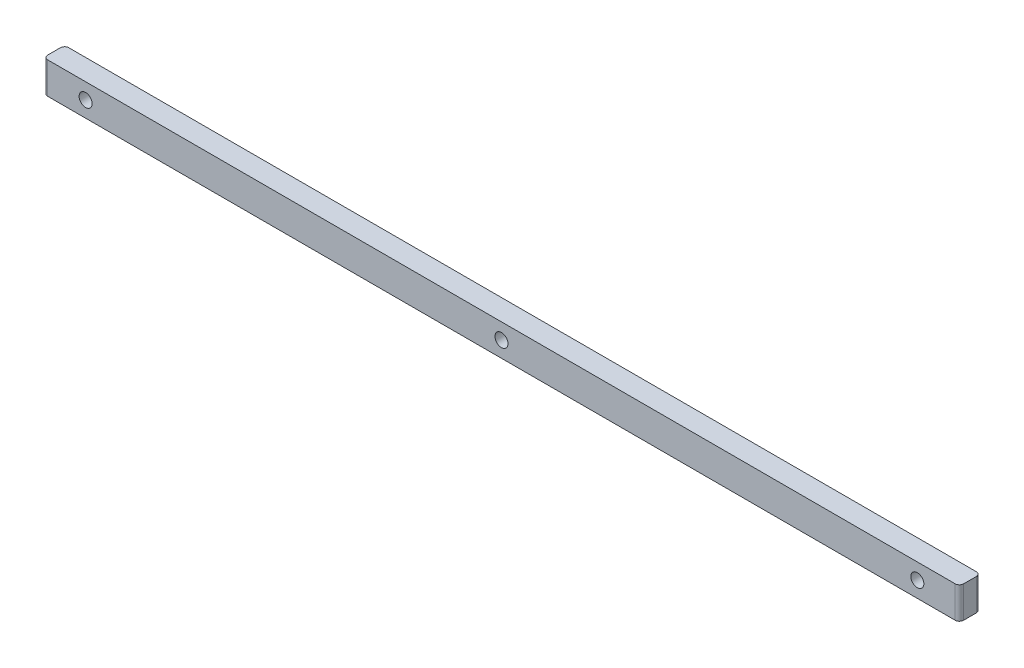
ISO-10303-21;
HEADER;
FILE_DESCRIPTION(('STEP AP214'),'2;1');
FILE_NAME('part.step','',(''),(''),'','','');
FILE_SCHEMA(('AUTOMOTIVE_DESIGN { 1 0 10303 214 1 1 1 1 }'));
ENDSEC;
DATA;
#1=APPLICATION_CONTEXT('core data for automotive mechanical design processes');
#2=APPLICATION_PROTOCOL_DEFINITION('international standard','automotive_design',2000,#1);
#3=PRODUCT_CONTEXT('',#1,'mechanical');
#4=PRODUCT('Part','Part','',(#3));
#5=PRODUCT_RELATED_PRODUCT_CATEGORY('part','',(#4));
#6=PRODUCT_DEFINITION_FORMATION('','',#4);
#7=PRODUCT_DEFINITION_CONTEXT('part definition',#1,'design');
#8=PRODUCT_DEFINITION('design','',#6,#7);
#9=PRODUCT_DEFINITION_SHAPE('','',#8);
#10=(LENGTH_UNIT() NAMED_UNIT(*) SI_UNIT(.MILLI.,.METRE.));
#11=(NAMED_UNIT(*) PLANE_ANGLE_UNIT() SI_UNIT($,.RADIAN.));
#12=(NAMED_UNIT(*) SI_UNIT($,.STERADIAN.) SOLID_ANGLE_UNIT());
#13=UNCERTAINTY_MEASURE_WITH_UNIT(LENGTH_MEASURE(1.E-05),#10,'distance_accuracy_value','');
#14=(GEOMETRIC_REPRESENTATION_CONTEXT(3) GLOBAL_UNCERTAINTY_ASSIGNED_CONTEXT((#13)) GLOBAL_UNIT_ASSIGNED_CONTEXT((#10,
#11,#12)) REPRESENTATION_CONTEXT('',''));
#15=CARTESIAN_POINT('',(0.,0.,0.));
#16=DIRECTION('',(0.,0.,1.));
#17=DIRECTION('',(1.,0.,0.));
#18=AXIS2_PLACEMENT_3D('',#15,#16,#17);
#19=CARTESIAN_POINT('',(276.225,-9.525,6.35));
#20=DIRECTION('',(-1.,0.,0.));
#21=DIRECTION('',(0.,0.,1.));
#22=AXIS2_PLACEMENT_3D('',#19,#20,#21);
#23=PLANE('',#22);
#24=DIRECTION('',(0.,0.,-1.));
#25=VECTOR('',#24,1.);
#26=CARTESIAN_POINT('',(276.225,-9.525,6.35));
#27=LINE('',#26,#25);
#28=CARTESIAN_POINT('',(276.225,-9.525,3.81));
#29=VERTEX_POINT('',#28);
#30=CARTESIAN_POINT('',(276.225,-9.525,-3.81));
#31=VERTEX_POINT('',#30);
#32=EDGE_CURVE('E130',#29,#31,#27,.T.);
#33=ORIENTED_EDGE('',*,*,#32,.T.);
#34=DIRECTION('',(0.,1.,0.));
#35=VECTOR('',#34,1.);
#36=CARTESIAN_POINT('',(276.225,9.525,-3.81));
#37=LINE('',#36,#35);
#38=CARTESIAN_POINT('',(276.225,9.525,-3.81));
#39=VERTEX_POINT('',#38);
#40=EDGE_CURVE('E11',#31,#39,#37,.T.);
#41=ORIENTED_EDGE('',*,*,#40,.T.);
#42=DIRECTION('',(0.,0.,-1.));
#43=VECTOR('',#42,1.);
#44=CARTESIAN_POINT('',(276.225,9.525,6.35));
#45=LINE('',#44,#43);
#46=CARTESIAN_POINT('',(276.225,9.525,3.81));
#47=VERTEX_POINT('',#46);
#48=EDGE_CURVE('E136',#47,#39,#45,.T.);
#49=ORIENTED_EDGE('',*,*,#48,.F.);
#50=DIRECTION('',(0.,1.,0.));
#51=VECTOR('',#50,1.);
#52=CARTESIAN_POINT('',(276.225,-9.525,3.81));
#53=LINE('',#52,#51);
#54=EDGE_CURVE('E48',#47,#29,#53,.F.);
#55=ORIENTED_EDGE('',*,*,#54,.T.);
#56=EDGE_LOOP('',(#33,#41,#49,#55));
#57=FACE_BOUND('',#56,.T.);
#58=ADVANCED_FACE('F39',(#57),#23,.F.);
#59=CARTESIAN_POINT('',(-276.225,9.525,6.35));
#60=DIRECTION('',(0.,-1.,0.));
#61=DIRECTION('',(0.,0.,-1.));
#62=AXIS2_PLACEMENT_3D('',#59,#60,#61);
#63=PLANE('',#62);
#64=DIRECTION('',(-1.,0.,0.));
#65=VECTOR('',#64,1.);
#66=CARTESIAN_POINT('',(-276.225,9.525,-6.35));
#67=LINE('',#66,#65);
#68=CARTESIAN_POINT('',(273.685,9.525,-6.35));
#69=VERTEX_POINT('',#68);
#70=CARTESIAN_POINT('',(-273.685,9.525,-6.35));
#71=VERTEX_POINT('',#70);
#72=EDGE_CURVE('E196',#69,#71,#67,.T.);
#73=ORIENTED_EDGE('',*,*,#72,.T.);
#74=CARTESIAN_POINT('',(-273.685,9.525,-3.81));
#75=DIRECTION('',(0.,-1.,0.));
#76=DIRECTION('',(0.,0.,-1.));
#77=AXIS2_PLACEMENT_3D('',#74,#75,#76);
#78=CIRCLE('',#77,2.54);
#79=CARTESIAN_POINT('',(-276.225,9.525,-3.81));
#80=VERTEX_POINT('',#79);
#81=EDGE_CURVE('E163',#71,#80,#78,.F.);
#82=ORIENTED_EDGE('',*,*,#81,.T.);
#83=DIRECTION('',(0.,0.,-1.));
#84=VECTOR('',#83,1.);
#85=CARTESIAN_POINT('',(-276.225,9.525,6.35));
#86=LINE('',#85,#84);
#87=CARTESIAN_POINT('',(-276.225,9.525,3.81));
#88=VERTEX_POINT('',#87);
#89=EDGE_CURVE('E129',#88,#80,#86,.T.);
#90=ORIENTED_EDGE('',*,*,#89,.F.);
#91=CARTESIAN_POINT('',(-273.685,9.525,3.81));
#92=DIRECTION('',(0.,-1.,0.));
#93=DIRECTION('',(0.,0.,-1.));
#94=AXIS2_PLACEMENT_3D('',#91,#92,#93);
#95=CIRCLE('',#94,2.54);
#96=CARTESIAN_POINT('',(-273.685,9.525,6.35));
#97=VERTEX_POINT('',#96);
#98=EDGE_CURVE('E134',#88,#97,#95,.F.);
#99=ORIENTED_EDGE('',*,*,#98,.T.);
#100=DIRECTION('',(-1.,0.,0.));
#101=VECTOR('',#100,1.);
#102=CARTESIAN_POINT('',(-276.225,9.525,6.35));
#103=LINE('',#102,#101);
#104=CARTESIAN_POINT('',(273.685,9.525,6.35));
#105=VERTEX_POINT('',#104);
#106=EDGE_CURVE('E187',#105,#97,#103,.T.);
#107=ORIENTED_EDGE('',*,*,#106,.F.);
#108=CARTESIAN_POINT('',(273.685,9.525,3.81));
#109=DIRECTION('',(0.,-1.,0.));
#110=DIRECTION('',(0.,0.,-1.));
#111=AXIS2_PLACEMENT_3D('',#108,#109,#110);
#112=CIRCLE('',#111,2.54);
#113=EDGE_CURVE('E62',#105,#47,#112,.F.);
#114=ORIENTED_EDGE('',*,*,#113,.T.);
#115=ORIENTED_EDGE('',*,*,#48,.T.);
#116=CARTESIAN_POINT('',(273.685,9.525,-3.81));
#117=DIRECTION('',(0.,-1.,0.));
#118=DIRECTION('',(0.,0.,-1.));
#119=AXIS2_PLACEMENT_3D('',#116,#117,#118);
#120=CIRCLE('',#119,2.54);
#121=EDGE_CURVE('E55',#39,#69,#120,.F.);
#122=ORIENTED_EDGE('',*,*,#121,.T.);
#123=EDGE_LOOP('',(#73,#82,#90,#99,#107,#114,#115,#122));
#124=FACE_BOUND('',#123,.T.);
#125=ADVANCED_FACE('F189',(#124),#63,.F.);
#126=CARTESIAN_POINT('',(-276.225,-9.525,6.35));
#127=DIRECTION('',(1.,0.,0.));
#128=DIRECTION('',(0.,0.,-1.));
#129=AXIS2_PLACEMENT_3D('',#126,#127,#128);
#130=PLANE('',#129);
#131=ORIENTED_EDGE('',*,*,#89,.T.);
#132=DIRECTION('',(0.,-1.,0.));
#133=VECTOR('',#132,1.);
#134=CARTESIAN_POINT('',(-276.225,-9.525,-3.81));
#135=LINE('',#134,#133);
#136=CARTESIAN_POINT('',(-276.225,-9.525,-3.81));
#137=VERTEX_POINT('',#136);
#138=EDGE_CURVE('E127',#80,#137,#135,.T.);
#139=ORIENTED_EDGE('',*,*,#138,.T.);
#140=DIRECTION('',(0.,0.,-1.));
#141=VECTOR('',#140,1.);
#142=CARTESIAN_POINT('',(-276.225,-9.525,6.35));
#143=LINE('',#142,#141);
#144=CARTESIAN_POINT('',(-276.225,-9.525,3.81));
#145=VERTEX_POINT('',#144);
#146=EDGE_CURVE('E109',#145,#137,#143,.T.);
#147=ORIENTED_EDGE('',*,*,#146,.F.);
#148=DIRECTION('',(0.,-1.,0.));
#149=VECTOR('',#148,1.);
#150=CARTESIAN_POINT('',(-276.225,-9.525,3.81));
#151=LINE('',#150,#149);
#152=EDGE_CURVE('E124',#145,#88,#151,.F.);
#153=ORIENTED_EDGE('',*,*,#152,.T.);
#154=EDGE_LOOP('',(#131,#139,#147,#153));
#155=FACE_BOUND('',#154,.T.);
#156=ADVANCED_FACE('F123',(#155),#130,.F.);
#157=CARTESIAN_POINT('',(-276.225,-9.525,6.35));
#158=DIRECTION('',(0.,1.,0.));
#159=DIRECTION('',(0.,0.,1.));
#160=AXIS2_PLACEMENT_3D('',#157,#158,#159);
#161=PLANE('',#160);
#162=ORIENTED_EDGE('',*,*,#146,.T.);
#163=CARTESIAN_POINT('',(-273.685,-9.525,-3.81));
#164=DIRECTION('',(0.,1.,0.));
#165=DIRECTION('',(0.,0.,1.));
#166=AXIS2_PLACEMENT_3D('',#163,#164,#165);
#167=CIRCLE('',#166,2.54);
#168=CARTESIAN_POINT('',(-273.685,-9.525,-6.35));
#169=VERTEX_POINT('',#168);
#170=EDGE_CURVE('E117',#137,#169,#167,.F.);
#171=ORIENTED_EDGE('',*,*,#170,.T.);
#172=DIRECTION('',(1.,0.,0.));
#173=VECTOR('',#172,1.);
#174=CARTESIAN_POINT('',(-276.225,-9.525,-6.35));
#175=LINE('',#174,#173);
#176=CARTESIAN_POINT('',(273.685,-9.525,-6.35));
#177=VERTEX_POINT('',#176);
#178=EDGE_CURVE('E191',#169,#177,#175,.T.);
#179=ORIENTED_EDGE('',*,*,#178,.T.);
#180=CARTESIAN_POINT('',(273.685,-9.525,-3.81));
#181=DIRECTION('',(0.,1.,0.));
#182=DIRECTION('',(0.,0.,1.));
#183=AXIS2_PLACEMENT_3D('',#180,#181,#182);
#184=CIRCLE('',#183,2.54);
#185=EDGE_CURVE('E118',#177,#31,#184,.F.);
#186=ORIENTED_EDGE('',*,*,#185,.T.);
#187=ORIENTED_EDGE('',*,*,#32,.F.);
#188=CARTESIAN_POINT('',(273.685,-9.525,3.81));
#189=DIRECTION('',(0.,1.,0.));
#190=DIRECTION('',(0.,0.,1.));
#191=AXIS2_PLACEMENT_3D('',#188,#189,#190);
#192=CIRCLE('',#191,2.54);
#193=CARTESIAN_POINT('',(273.685,-9.525,6.35));
#194=VERTEX_POINT('',#193);
#195=EDGE_CURVE('E140',#29,#194,#192,.F.);
#196=ORIENTED_EDGE('',*,*,#195,.T.);
#197=DIRECTION('',(1.,0.,0.));
#198=VECTOR('',#197,1.);
#199=CARTESIAN_POINT('',(-276.225,-9.525,6.35));
#200=LINE('',#199,#198);
#201=CARTESIAN_POINT('',(-273.685,-9.525,6.35));
#202=VERTEX_POINT('',#201);
#203=EDGE_CURVE('E111',#202,#194,#200,.T.);
#204=ORIENTED_EDGE('',*,*,#203,.F.);
#205=CARTESIAN_POINT('',(-273.685,-9.525,3.81));
#206=DIRECTION('',(0.,1.,0.));
#207=DIRECTION('',(0.,0.,1.));
#208=AXIS2_PLACEMENT_3D('',#205,#206,#207);
#209=CIRCLE('',#208,2.54);
#210=EDGE_CURVE('E106',#202,#145,#209,.F.);
#211=ORIENTED_EDGE('',*,*,#210,.T.);
#212=EDGE_LOOP('',(#162,#171,#179,#186,#187,#196,#204,#211));
#213=FACE_BOUND('',#212,.T.);
#214=ADVANCED_FACE('F108',(#213),#161,.F.);
#215=CARTESIAN_POINT('',(0.,0.,6.35));
#216=DIRECTION('',(0.,0.,-1.));
#217=DIRECTION('',(-1.,0.,0.));
#218=AXIS2_PLACEMENT_3D('',#215,#216,#217);
#219=PLANE('',#218);
#220=CARTESIAN_POINT('',(-250.825,0.,6.35));
#221=DIRECTION('',(0.,0.,-1.));
#222=DIRECTION('',(-1.,0.,0.));
#223=AXIS2_PLACEMENT_3D('',#220,#221,#222);
#224=CIRCLE('',#223,3.937);
#225=CARTESIAN_POINT('',(-254.762,0.,6.35));
#226=VERTEX_POINT('',#225);
#227=EDGE_CURVE('E199',#226,#226,#224,.T.);
#228=ORIENTED_EDGE('',*,*,#227,.T.);
#229=EDGE_LOOP('',(#228));
#230=FACE_BOUND('',#229,.T.);
#231=CARTESIAN_POINT('',(0.,0.,6.35));
#232=DIRECTION('',(0.,0.,-1.));
#233=DIRECTION('',(-1.,0.,0.));
#234=AXIS2_PLACEMENT_3D('',#231,#232,#233);
#235=CIRCLE('',#234,3.937);
#236=CARTESIAN_POINT('',(-3.937,0.,6.35));
#237=VERTEX_POINT('',#236);
#238=EDGE_CURVE('E344',#237,#237,#235,.T.);
#239=ORIENTED_EDGE('',*,*,#238,.T.);
#240=EDGE_LOOP('',(#239));
#241=FACE_BOUND('',#240,.T.);
#242=CARTESIAN_POINT('',(250.825,0.,6.35));
#243=DIRECTION('',(0.,0.,-1.));
#244=DIRECTION('',(-1.,0.,0.));
#245=AXIS2_PLACEMENT_3D('',#242,#243,#244);
#246=CIRCLE('',#245,3.937);
#247=CARTESIAN_POINT('',(246.888,0.,6.35));
#248=VERTEX_POINT('',#247);
#249=EDGE_CURVE('E341',#248,#248,#246,.T.);
#250=ORIENTED_EDGE('',*,*,#249,.T.);
#251=EDGE_LOOP('',(#250));
#252=FACE_BOUND('',#251,.T.);
#253=ORIENTED_EDGE('',*,*,#106,.T.);
#254=DIRECTION('',(0.,-1.,0.));
#255=VECTOR('',#254,1.);
#256=CARTESIAN_POINT('',(-273.685,0.,6.35));
#257=LINE('',#256,#255);
#258=EDGE_CURVE('E170',#97,#202,#257,.T.);
#259=ORIENTED_EDGE('',*,*,#258,.T.);
#260=ORIENTED_EDGE('',*,*,#203,.T.);
#261=DIRECTION('',(0.,1.,0.));
#262=VECTOR('',#261,1.);
#263=CARTESIAN_POINT('',(273.685,0.,6.35));
#264=LINE('',#263,#262);
#265=EDGE_CURVE('E166',#194,#105,#264,.T.);
#266=ORIENTED_EDGE('',*,*,#265,.T.);
#267=EDGE_LOOP('',(#253,#259,#260,#266));
#268=FACE_BOUND('',#267,.T.);
#269=ADVANCED_FACE('F186',(#230,#241,#252,#268),#219,.F.);
#270=CARTESIAN_POINT('',(0.,0.,-6.35));
#271=DIRECTION('',(0.,0.,-1.));
#272=DIRECTION('',(-1.,0.,0.));
#273=AXIS2_PLACEMENT_3D('',#270,#271,#272);
#274=PLANE('',#273);
#275=CARTESIAN_POINT('',(-250.825,0.,-6.35));
#276=DIRECTION('',(0.,0.,1.));
#277=DIRECTION('',(1.,0.,0.));
#278=AXIS2_PLACEMENT_3D('',#275,#276,#277);
#279=CIRCLE('',#278,3.937);
#280=CARTESIAN_POINT('',(-246.888,0.,-6.35));
#281=VERTEX_POINT('',#280);
#282=EDGE_CURVE('E327',#281,#281,#279,.T.);
#283=ORIENTED_EDGE('',*,*,#282,.T.);
#284=EDGE_LOOP('',(#283));
#285=FACE_BOUND('',#284,.T.);
#286=CARTESIAN_POINT('',(0.,0.,-6.35));
#287=DIRECTION('',(0.,0.,1.));
#288=DIRECTION('',(1.,0.,0.));
#289=AXIS2_PLACEMENT_3D('',#286,#287,#288);
#290=CIRCLE('',#289,3.937);
#291=CARTESIAN_POINT('',(3.937,0.,-6.35));
#292=VERTEX_POINT('',#291);
#293=EDGE_CURVE('E331',#292,#292,#290,.T.);
#294=ORIENTED_EDGE('',*,*,#293,.T.);
#295=EDGE_LOOP('',(#294));
#296=FACE_BOUND('',#295,.T.);
#297=CARTESIAN_POINT('',(250.825,0.,-6.35));
#298=DIRECTION('',(0.,0.,1.));
#299=DIRECTION('',(1.,0.,0.));
#300=AXIS2_PLACEMENT_3D('',#297,#298,#299);
#301=CIRCLE('',#300,3.937);
#302=CARTESIAN_POINT('',(254.762,0.,-6.35));
#303=VERTEX_POINT('',#302);
#304=EDGE_CURVE('E334',#303,#303,#301,.T.);
#305=ORIENTED_EDGE('',*,*,#304,.T.);
#306=EDGE_LOOP('',(#305));
#307=FACE_BOUND('',#306,.T.);
#308=ORIENTED_EDGE('',*,*,#178,.F.);
#309=DIRECTION('',(0.,-1.,0.));
#310=VECTOR('',#309,1.);
#311=CARTESIAN_POINT('',(-273.685,9.525,-6.35));
#312=LINE('',#311,#310);
#313=EDGE_CURVE('E154',#169,#71,#312,.F.);
#314=ORIENTED_EDGE('',*,*,#313,.T.);
#315=ORIENTED_EDGE('',*,*,#72,.F.);
#316=DIRECTION('',(0.,1.,0.));
#317=VECTOR('',#316,1.);
#318=CARTESIAN_POINT('',(273.685,-9.525,-6.35));
#319=LINE('',#318,#317);
#320=EDGE_CURVE('E151',#69,#177,#319,.F.);
#321=ORIENTED_EDGE('',*,*,#320,.T.);
#322=EDGE_LOOP('',(#308,#314,#315,#321));
#323=FACE_BOUND('',#322,.T.);
#324=ADVANCED_FACE('F210',(#285,#296,#307,#323),#274,.T.);
#325=CARTESIAN_POINT('',(250.825,0.,-6.35));
#326=DIRECTION('',(0.,0.,1.));
#327=DIRECTION('',(1.,0.,0.));
#328=AXIS2_PLACEMENT_3D('',#325,#326,#327);
#329=CYLINDRICAL_SURFACE('',#328,3.937);
#330=ORIENTED_EDGE('',*,*,#304,.F.);
#331=EDGE_LOOP('',(#330));
#332=FACE_BOUND('',#331,.T.);
#333=ORIENTED_EDGE('',*,*,#249,.F.);
#334=EDGE_LOOP('',(#333));
#335=FACE_BOUND('',#334,.T.);
#336=ADVANCED_FACE('F238',(#332,#335),#329,.F.);
#337=CARTESIAN_POINT('',(0.,0.,-6.35));
#338=DIRECTION('',(0.,0.,1.));
#339=DIRECTION('',(1.,0.,0.));
#340=AXIS2_PLACEMENT_3D('',#337,#338,#339);
#341=CYLINDRICAL_SURFACE('',#340,3.937);
#342=ORIENTED_EDGE('',*,*,#293,.F.);
#343=EDGE_LOOP('',(#342));
#344=FACE_BOUND('',#343,.T.);
#345=ORIENTED_EDGE('',*,*,#238,.F.);
#346=EDGE_LOOP('',(#345));
#347=FACE_BOUND('',#346,.T.);
#348=ADVANCED_FACE('F233',(#344,#347),#341,.F.);
#349=CARTESIAN_POINT('',(-250.825,0.,-6.35));
#350=DIRECTION('',(0.,0.,1.));
#351=DIRECTION('',(1.,0.,0.));
#352=AXIS2_PLACEMENT_3D('',#349,#350,#351);
#353=CYLINDRICAL_SURFACE('',#352,3.937);
#354=ORIENTED_EDGE('',*,*,#282,.F.);
#355=EDGE_LOOP('',(#354));
#356=FACE_BOUND('',#355,.T.);
#357=ORIENTED_EDGE('',*,*,#227,.F.);
#358=EDGE_LOOP('',(#357));
#359=FACE_BOUND('',#358,.T.);
#360=ADVANCED_FACE('F229',(#356,#359),#353,.F.);
#361=CARTESIAN_POINT('',(-273.685,-9.525,-3.81));
#362=DIRECTION('',(0.,1.,0.));
#363=DIRECTION('',(0.,0.,1.));
#364=AXIS2_PLACEMENT_3D('',#361,#362,#363);
#365=CYLINDRICAL_SURFACE('',#364,2.54);
#366=ORIENTED_EDGE('',*,*,#81,.F.);
#367=ORIENTED_EDGE('',*,*,#313,.F.);
#368=ORIENTED_EDGE('',*,*,#170,.F.);
#369=ORIENTED_EDGE('',*,*,#138,.F.);
#370=EDGE_LOOP('',(#366,#367,#368,#369));
#371=FACE_BOUND('',#370,.T.);
#372=ADVANCED_FACE('F206',(#371),#365,.T.);
#373=CARTESIAN_POINT('',(-273.685,0.,3.81));
#374=DIRECTION('',(0.,-1.,0.));
#375=DIRECTION('',(0.,0.,-1.));
#376=AXIS2_PLACEMENT_3D('',#373,#374,#375);
#377=CYLINDRICAL_SURFACE('',#376,2.54);
#378=ORIENTED_EDGE('',*,*,#98,.F.);
#379=ORIENTED_EDGE('',*,*,#152,.F.);
#380=ORIENTED_EDGE('',*,*,#210,.F.);
#381=ORIENTED_EDGE('',*,*,#258,.F.);
#382=EDGE_LOOP('',(#378,#379,#380,#381));
#383=FACE_BOUND('',#382,.T.);
#384=ADVANCED_FACE('F133',(#383),#377,.T.);
#385=CARTESIAN_POINT('',(273.685,-9.525,-3.81));
#386=DIRECTION('',(0.,-1.,0.));
#387=DIRECTION('',(0.,0.,-1.));
#388=AXIS2_PLACEMENT_3D('',#385,#386,#387);
#389=CYLINDRICAL_SURFACE('',#388,2.54);
#390=ORIENTED_EDGE('',*,*,#185,.F.);
#391=ORIENTED_EDGE('',*,*,#320,.F.);
#392=ORIENTED_EDGE('',*,*,#121,.F.);
#393=ORIENTED_EDGE('',*,*,#40,.F.);
#394=EDGE_LOOP('',(#390,#391,#392,#393));
#395=FACE_BOUND('',#394,.T.);
#396=ADVANCED_FACE('F212',(#395),#389,.T.);
#397=CARTESIAN_POINT('',(273.685,0.,3.81));
#398=DIRECTION('',(0.,1.,0.));
#399=DIRECTION('',(0.,0.,1.));
#400=AXIS2_PLACEMENT_3D('',#397,#398,#399);
#401=CYLINDRICAL_SURFACE('',#400,2.54);
#402=ORIENTED_EDGE('',*,*,#195,.F.);
#403=ORIENTED_EDGE('',*,*,#54,.F.);
#404=ORIENTED_EDGE('',*,*,#113,.F.);
#405=ORIENTED_EDGE('',*,*,#265,.F.);
#406=EDGE_LOOP('',(#402,#403,#404,#405));
#407=FACE_BOUND('',#406,.T.);
#408=ADVANCED_FACE('F41',(#407),#401,.T.);
#409=CLOSED_SHELL('',(#58,#125,#156,#214,#269,#324,#336,#348,#360,#372,#384,#396,#408));
#410=MANIFOLD_SOLID_BREP('B2',#409);
#411=ADVANCED_BREP_SHAPE_REPRESENTATION('',(#18,#410),#14);
#412=SHAPE_DEFINITION_REPRESENTATION(#9,#411);
ENDSEC;
END-ISO-10303-21;
